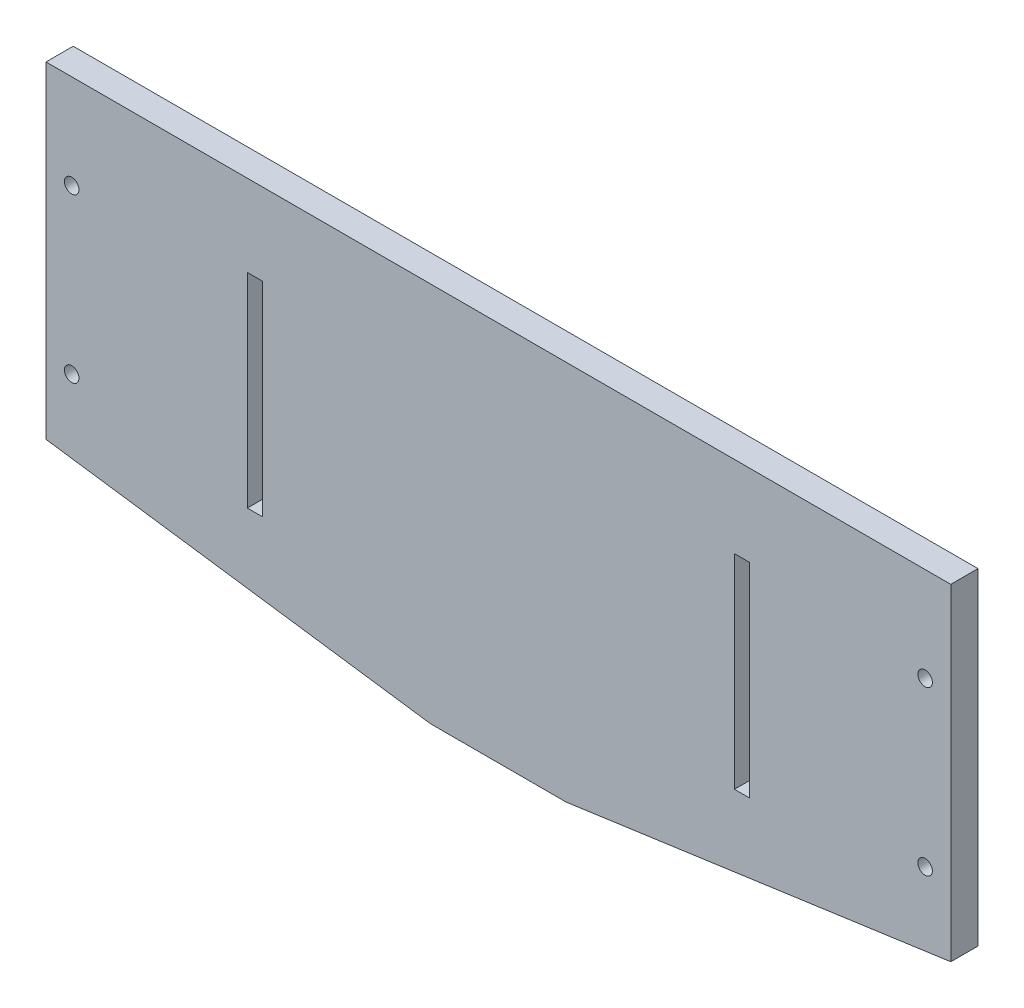
ISO-10303-21;
HEADER;
FILE_DESCRIPTION(('STEP AP214'),'2;1');
FILE_NAME('part.step','',(''),(''),'','','');
FILE_SCHEMA(('AUTOMOTIVE_DESIGN { 1 0 10303 214 1 1 1 1 }'));
ENDSEC;
DATA;
#1=APPLICATION_CONTEXT('core data for automotive mechanical design processes');
#2=APPLICATION_PROTOCOL_DEFINITION('international standard','automotive_design',2000,#1);
#3=PRODUCT_CONTEXT('',#1,'mechanical');
#4=PRODUCT('Part','Part','',(#3));
#5=PRODUCT_RELATED_PRODUCT_CATEGORY('part','',(#4));
#6=PRODUCT_DEFINITION_FORMATION('','',#4);
#7=PRODUCT_DEFINITION_CONTEXT('part definition',#1,'design');
#8=PRODUCT_DEFINITION('design','',#6,#7);
#9=PRODUCT_DEFINITION_SHAPE('','',#8);
#10=(LENGTH_UNIT() NAMED_UNIT(*) SI_UNIT(.MILLI.,.METRE.));
#11=(NAMED_UNIT(*) PLANE_ANGLE_UNIT() SI_UNIT($,.RADIAN.));
#12=(NAMED_UNIT(*) SI_UNIT($,.STERADIAN.) SOLID_ANGLE_UNIT());
#13=UNCERTAINTY_MEASURE_WITH_UNIT(LENGTH_MEASURE(1.E-05),#10,'distance_accuracy_value','');
#14=(GEOMETRIC_REPRESENTATION_CONTEXT(3) GLOBAL_UNCERTAINTY_ASSIGNED_CONTEXT((#13)) GLOBAL_UNIT_ASSIGNED_CONTEXT((#10,
#11,#12)) REPRESENTATION_CONTEXT('',''));
#15=CARTESIAN_POINT('',(0.,0.,0.));
#16=DIRECTION('',(0.,0.,1.));
#17=DIRECTION('',(1.,0.,0.));
#18=AXIS2_PLACEMENT_3D('',#15,#16,#17);
#19=CARTESIAN_POINT('',(0.,0.,0.));
#20=DIRECTION('',(0.,0.,-1.));
#21=DIRECTION('',(-1.,0.,0.));
#22=AXIS2_PLACEMENT_3D('',#19,#20,#21);
#23=PLANE('',#22);
#24=DIRECTION('',(-0.99026806874157,0.139173100960066,0.));
#25=VECTOR('',#24,1.);
#26=CARTESIAN_POINT('',(0.,50.7083117954887,0.));
#27=LINE('',#26,#25);
#28=CARTESIAN_POINT('',(89.7128,38.1,0.));
#29=VERTEX_POINT('',#28);
#30=CARTESIAN_POINT('',(0.,50.7083117954887,0.));
#31=VERTEX_POINT('',#30);
#32=EDGE_CURVE('E152',#29,#31,#27,.T.);
#33=ORIENTED_EDGE('',*,*,#32,.T.);
#34=DIRECTION('',(0.,-1.,0.));
#35=VECTOR('',#34,1.);
#36=CARTESIAN_POINT('',(0.,127.,0.));
#37=LINE('',#36,#35);
#38=CARTESIAN_POINT('',(0.,127.,0.));
#39=VERTEX_POINT('',#38);
#40=EDGE_CURVE('E159',#39,#31,#37,.T.);
#41=ORIENTED_EDGE('',*,*,#40,.F.);
#42=DIRECTION('',(-1.,0.,0.));
#43=VECTOR('',#42,1.);
#44=CARTESIAN_POINT('',(211.1756,127.,0.));
#45=LINE('',#44,#43);
#46=CARTESIAN_POINT('',(211.1756,127.,0.));
#47=VERTEX_POINT('',#46);
#48=EDGE_CURVE('E158',#47,#39,#45,.T.);
#49=ORIENTED_EDGE('',*,*,#48,.F.);
#50=DIRECTION('',(0.,1.,0.));
#51=VECTOR('',#50,1.);
#52=CARTESIAN_POINT('',(211.1756,127.,0.));
#53=LINE('',#52,#51);
#54=CARTESIAN_POINT('',(211.1756,50.7083117954887,0.));
#55=VERTEX_POINT('',#54);
#56=EDGE_CURVE('E150',#55,#47,#53,.T.);
#57=ORIENTED_EDGE('',*,*,#56,.F.);
#58=DIRECTION('',(-0.99026806874157,-0.139173100960066,0.));
#59=VECTOR('',#58,1.);
#60=CARTESIAN_POINT('',(121.4628,38.1,0.));
#61=LINE('',#60,#59);
#62=CARTESIAN_POINT('',(121.4628,38.1,0.));
#63=VERTEX_POINT('',#62);
#64=EDGE_CURVE('E136',#55,#63,#61,.T.);
#65=ORIENTED_EDGE('',*,*,#64,.T.);
#66=DIRECTION('',(-1.,0.,0.));
#67=VECTOR('',#66,1.);
#68=CARTESIAN_POINT('',(89.7128,38.1,0.));
#69=LINE('',#68,#67);
#70=EDGE_CURVE('E143',#63,#29,#69,.T.);
#71=ORIENTED_EDGE('',*,*,#70,.T.);
#72=EDGE_LOOP('',(#33,#41,#49,#57,#65,#71));
#73=FACE_BOUND('',#72,.T.);
#74=DIRECTION('',(0.,-1.,0.));
#75=VECTOR('',#74,1.);
#76=CARTESIAN_POINT('',(46.99,107.95,0.));
#77=LINE('',#76,#75);
#78=CARTESIAN_POINT('',(46.99,107.95,0.));
#79=VERTEX_POINT('',#78);
#80=CARTESIAN_POINT('',(46.99,60.325,0.));
#81=VERTEX_POINT('',#80);
#82=EDGE_CURVE('E248',#79,#81,#77,.T.);
#83=ORIENTED_EDGE('',*,*,#82,.T.);
#84=DIRECTION('',(1.,0.,0.));
#85=VECTOR('',#84,1.);
#86=CARTESIAN_POINT('',(46.99,60.325,0.));
#87=LINE('',#86,#85);
#88=CARTESIAN_POINT('',(50.4952,60.325,0.));
#89=VERTEX_POINT('',#88);
#90=EDGE_CURVE('E259',#81,#89,#87,.T.);
#91=ORIENTED_EDGE('',*,*,#90,.T.);
#92=DIRECTION('',(0.,1.,0.));
#93=VECTOR('',#92,1.);
#94=CARTESIAN_POINT('',(50.4952,107.95,0.));
#95=LINE('',#94,#93);
#96=CARTESIAN_POINT('',(50.4952,107.95,0.));
#97=VERTEX_POINT('',#96);
#98=EDGE_CURVE('E59',#89,#97,#95,.T.);
#99=ORIENTED_EDGE('',*,*,#98,.T.);
#100=DIRECTION('',(-1.,0.,0.));
#101=VECTOR('',#100,1.);
#102=CARTESIAN_POINT('',(46.99,107.95,0.));
#103=LINE('',#102,#101);
#104=EDGE_CURVE('E240',#97,#79,#103,.T.);
#105=ORIENTED_EDGE('',*,*,#104,.T.);
#106=EDGE_LOOP('',(#83,#91,#99,#105));
#107=FACE_BOUND('',#106,.T.);
#108=DIRECTION('',(0.,-1.,0.));
#109=VECTOR('',#108,1.);
#110=CARTESIAN_POINT('',(160.6804,107.95,0.));
#111=LINE('',#110,#109);
#112=CARTESIAN_POINT('',(160.6804,107.95,0.));
#113=VERTEX_POINT('',#112);
#114=CARTESIAN_POINT('',(160.6804,60.325,0.));
#115=VERTEX_POINT('',#114);
#116=EDGE_CURVE('E216',#113,#115,#111,.T.);
#117=ORIENTED_EDGE('',*,*,#116,.T.);
#118=DIRECTION('',(1.,0.,0.));
#119=VECTOR('',#118,1.);
#120=CARTESIAN_POINT('',(160.6804,60.325,0.));
#121=LINE('',#120,#119);
#122=CARTESIAN_POINT('',(164.1856,60.325,0.));
#123=VERTEX_POINT('',#122);
#124=EDGE_CURVE('E231',#115,#123,#121,.T.);
#125=ORIENTED_EDGE('',*,*,#124,.T.);
#126=DIRECTION('',(0.,1.,0.));
#127=VECTOR('',#126,1.);
#128=CARTESIAN_POINT('',(164.1856,107.95,0.));
#129=LINE('',#128,#127);
#130=CARTESIAN_POINT('',(164.1856,107.95,0.));
#131=VERTEX_POINT('',#130);
#132=EDGE_CURVE('E228',#123,#131,#129,.T.);
#133=ORIENTED_EDGE('',*,*,#132,.T.);
#134=DIRECTION('',(-1.,0.,0.));
#135=VECTOR('',#134,1.);
#136=CARTESIAN_POINT('',(160.6804,107.95,0.));
#137=LINE('',#136,#135);
#138=EDGE_CURVE('E206',#131,#113,#137,.T.);
#139=ORIENTED_EDGE('',*,*,#138,.T.);
#140=EDGE_LOOP('',(#117,#125,#133,#139));
#141=FACE_BOUND('',#140,.T.);
#142=CARTESIAN_POINT('',(5.99440000000001,105.0036,0.));
#143=DIRECTION('',(0.,0.,1.));
#144=DIRECTION('',(1.,0.,0.));
#145=AXIS2_PLACEMENT_3D('',#142,#143,#144);
#146=CIRCLE('',#145,1.7);
#147=CARTESIAN_POINT('',(7.69440000000001,105.0036,0.));
#148=VERTEX_POINT('',#147);
#149=EDGE_CURVE('E195',#148,#148,#146,.T.);
#150=ORIENTED_EDGE('',*,*,#149,.T.);
#151=EDGE_LOOP('',(#150));
#152=FACE_BOUND('',#151,.T.);
#153=CARTESIAN_POINT('',(5.99440000000001,66.9036,0.));
#154=DIRECTION('',(0.,0.,1.));
#155=DIRECTION('',(1.,0.,0.));
#156=AXIS2_PLACEMENT_3D('',#153,#154,#155);
#157=CIRCLE('',#156,1.7);
#158=CARTESIAN_POINT('',(7.69440000000001,66.9036,0.));
#159=VERTEX_POINT('',#158);
#160=EDGE_CURVE('E189',#159,#159,#157,.T.);
#161=ORIENTED_EDGE('',*,*,#160,.T.);
#162=EDGE_LOOP('',(#161));
#163=FACE_BOUND('',#162,.T.);
#164=CARTESIAN_POINT('',(205.1812,66.9036,0.));
#165=DIRECTION('',(0.,0.,1.));
#166=DIRECTION('',(1.,0.,0.));
#167=AXIS2_PLACEMENT_3D('',#164,#165,#166);
#168=CIRCLE('',#167,1.70000000000001);
#169=CARTESIAN_POINT('',(206.8812,66.9036,0.));
#170=VERTEX_POINT('',#169);
#171=EDGE_CURVE('E183',#170,#170,#168,.T.);
#172=ORIENTED_EDGE('',*,*,#171,.T.);
#173=EDGE_LOOP('',(#172));
#174=FACE_BOUND('',#173,.T.);
#175=CARTESIAN_POINT('',(205.1812,105.0036,0.));
#176=DIRECTION('',(0.,0.,1.));
#177=DIRECTION('',(1.,0.,0.));
#178=AXIS2_PLACEMENT_3D('',#175,#176,#177);
#179=CIRCLE('',#178,1.70000000000001);
#180=CARTESIAN_POINT('',(206.8812,105.0036,0.));
#181=VERTEX_POINT('',#180);
#182=EDGE_CURVE('E164',#181,#181,#179,.T.);
#183=ORIENTED_EDGE('',*,*,#182,.T.);
#184=EDGE_LOOP('',(#183));
#185=FACE_BOUND('',#184,.T.);
#186=ADVANCED_FACE('F36',(#73,#107,#141,#152,#163,#174,#185),#23,.T.);
#187=CARTESIAN_POINT('',(0.,127.,6.35));
#188=DIRECTION('',(1.,0.,0.));
#189=DIRECTION('',(0.,1.,0.));
#190=AXIS2_PLACEMENT_3D('',#187,#188,#189);
#191=PLANE('',#190);
#192=ORIENTED_EDGE('',*,*,#40,.T.);
#193=DIRECTION('',(0.,0.,1.));
#194=VECTOR('',#193,1.);
#195=CARTESIAN_POINT('',(0.,50.7083117954887,0.));
#196=LINE('',#195,#194);
#197=CARTESIAN_POINT('',(0.,50.7083117954887,6.35));
#198=VERTEX_POINT('',#197);
#199=EDGE_CURVE('E225',#31,#198,#196,.T.);
#200=ORIENTED_EDGE('',*,*,#199,.T.);
#201=DIRECTION('',(0.,-1.,0.));
#202=VECTOR('',#201,1.);
#203=CARTESIAN_POINT('',(0.,127.,6.35));
#204=LINE('',#203,#202);
#205=CARTESIAN_POINT('',(0.,127.,6.35));
#206=VERTEX_POINT('',#205);
#207=EDGE_CURVE('E161',#206,#198,#204,.T.);
#208=ORIENTED_EDGE('',*,*,#207,.F.);
#209=DIRECTION('',(0.,0.,-1.));
#210=VECTOR('',#209,1.);
#211=CARTESIAN_POINT('',(0.,127.,6.35));
#212=LINE('',#211,#210);
#213=EDGE_CURVE('E44',#206,#39,#212,.T.);
#214=ORIENTED_EDGE('',*,*,#213,.T.);
#215=EDGE_LOOP('',(#192,#200,#208,#214));
#216=FACE_BOUND('',#215,.T.);
#217=ADVANCED_FACE('F38',(#216),#191,.F.);
#218=CARTESIAN_POINT('',(211.1756,127.,6.35));
#219=DIRECTION('',(-1.,0.,0.));
#220=DIRECTION('',(0.,-1.,0.));
#221=AXIS2_PLACEMENT_3D('',#218,#219,#220);
#222=PLANE('',#221);
#223=DIRECTION('',(0.,1.,0.));
#224=VECTOR('',#223,1.);
#225=CARTESIAN_POINT('',(211.1756,127.,6.35));
#226=LINE('',#225,#224);
#227=CARTESIAN_POINT('',(211.1756,50.7083117954887,6.35));
#228=VERTEX_POINT('',#227);
#229=CARTESIAN_POINT('',(211.1756,127.,6.35));
#230=VERTEX_POINT('',#229);
#231=EDGE_CURVE('E151',#228,#230,#226,.T.);
#232=ORIENTED_EDGE('',*,*,#231,.F.);
#233=DIRECTION('',(0.,0.,1.));
#234=VECTOR('',#233,1.);
#235=CARTESIAN_POINT('',(211.1756,50.7083117954887,0.));
#236=LINE('',#235,#234);
#237=EDGE_CURVE('E51',#55,#228,#236,.T.);
#238=ORIENTED_EDGE('',*,*,#237,.F.);
#239=ORIENTED_EDGE('',*,*,#56,.T.);
#240=DIRECTION('',(0.,0.,-1.));
#241=VECTOR('',#240,1.);
#242=CARTESIAN_POINT('',(211.1756,127.,6.35));
#243=LINE('',#242,#241);
#244=EDGE_CURVE('E11',#230,#47,#243,.T.);
#245=ORIENTED_EDGE('',*,*,#244,.F.);
#246=EDGE_LOOP('',(#232,#238,#239,#245));
#247=FACE_BOUND('',#246,.T.);
#248=ADVANCED_FACE('F148',(#247),#222,.F.);
#249=CARTESIAN_POINT('',(211.1756,127.,6.35));
#250=DIRECTION('',(0.,-1.,0.));
#251=DIRECTION('',(1.,0.,0.));
#252=AXIS2_PLACEMENT_3D('',#249,#250,#251);
#253=PLANE('',#252);
#254=ORIENTED_EDGE('',*,*,#48,.T.);
#255=ORIENTED_EDGE('',*,*,#213,.F.);
#256=DIRECTION('',(-1.,0.,0.));
#257=VECTOR('',#256,1.);
#258=CARTESIAN_POINT('',(211.1756,127.,6.35));
#259=LINE('',#258,#257);
#260=EDGE_CURVE('E168',#230,#206,#259,.T.);
#261=ORIENTED_EDGE('',*,*,#260,.F.);
#262=ORIENTED_EDGE('',*,*,#244,.T.);
#263=EDGE_LOOP('',(#254,#255,#261,#262));
#264=FACE_BOUND('',#263,.T.);
#265=ADVANCED_FACE('F285',(#264),#253,.F.);
#266=CARTESIAN_POINT('',(0.,0.,6.35));
#267=DIRECTION('',(0.,0.,-1.));
#268=DIRECTION('',(-1.,0.,0.));
#269=AXIS2_PLACEMENT_3D('',#266,#267,#268);
#270=PLANE('',#269);
#271=DIRECTION('',(1.,0.,0.));
#272=VECTOR('',#271,1.);
#273=CARTESIAN_POINT('',(46.99,60.325,6.35));
#274=LINE('',#273,#272);
#275=CARTESIAN_POINT('',(46.99,60.325,6.35));
#276=VERTEX_POINT('',#275);
#277=CARTESIAN_POINT('',(50.4952,60.325,6.35));
#278=VERTEX_POINT('',#277);
#279=EDGE_CURVE('E252',#276,#278,#274,.T.);
#280=ORIENTED_EDGE('',*,*,#279,.F.);
#281=DIRECTION('',(0.,-1.,0.));
#282=VECTOR('',#281,1.);
#283=CARTESIAN_POINT('',(46.99,107.95,6.35));
#284=LINE('',#283,#282);
#285=CARTESIAN_POINT('',(46.99,107.95,6.35));
#286=VERTEX_POINT('',#285);
#287=EDGE_CURVE('E212',#286,#276,#284,.T.);
#288=ORIENTED_EDGE('',*,*,#287,.F.);
#289=DIRECTION('',(-1.,0.,0.));
#290=VECTOR('',#289,1.);
#291=CARTESIAN_POINT('',(46.99,107.95,6.35));
#292=LINE('',#291,#290);
#293=CARTESIAN_POINT('',(50.4952,107.95,6.35));
#294=VERTEX_POINT('',#293);
#295=EDGE_CURVE('E245',#294,#286,#292,.T.);
#296=ORIENTED_EDGE('',*,*,#295,.F.);
#297=DIRECTION('',(0.,1.,0.));
#298=VECTOR('',#297,1.);
#299=CARTESIAN_POINT('',(50.4952,107.95,6.35));
#300=LINE('',#299,#298);
#301=EDGE_CURVE('E249',#278,#294,#300,.T.);
#302=ORIENTED_EDGE('',*,*,#301,.F.);
#303=EDGE_LOOP('',(#280,#288,#296,#302));
#304=FACE_BOUND('',#303,.T.);
#305=DIRECTION('',(1.,0.,0.));
#306=VECTOR('',#305,1.);
#307=CARTESIAN_POINT('',(160.6804,60.325,6.35));
#308=LINE('',#307,#306);
#309=CARTESIAN_POINT('',(160.6804,60.325,6.35));
#310=VERTEX_POINT('',#309);
#311=CARTESIAN_POINT('',(164.1856,60.325,6.35));
#312=VERTEX_POINT('',#311);
#313=EDGE_CURVE('E220',#310,#312,#308,.T.);
#314=ORIENTED_EDGE('',*,*,#313,.F.);
#315=DIRECTION('',(0.,-1.,0.));
#316=VECTOR('',#315,1.);
#317=CARTESIAN_POINT('',(160.6804,107.95,6.35));
#318=LINE('',#317,#316);
#319=CARTESIAN_POINT('',(160.6804,107.95,6.35));
#320=VERTEX_POINT('',#319);
#321=EDGE_CURVE('E223',#320,#310,#318,.T.);
#322=ORIENTED_EDGE('',*,*,#321,.F.);
#323=DIRECTION('',(-1.,0.,0.));
#324=VECTOR('',#323,1.);
#325=CARTESIAN_POINT('',(160.6804,107.95,6.35));
#326=LINE('',#325,#324);
#327=CARTESIAN_POINT('',(164.1856,107.95,6.35));
#328=VERTEX_POINT('',#327);
#329=EDGE_CURVE('E213',#328,#320,#326,.T.);
#330=ORIENTED_EDGE('',*,*,#329,.F.);
#331=DIRECTION('',(0.,1.,0.));
#332=VECTOR('',#331,1.);
#333=CARTESIAN_POINT('',(164.1856,107.95,6.35));
#334=LINE('',#333,#332);
#335=EDGE_CURVE('E217',#312,#328,#334,.T.);
#336=ORIENTED_EDGE('',*,*,#335,.F.);
#337=EDGE_LOOP('',(#314,#322,#330,#336));
#338=FACE_BOUND('',#337,.T.);
#339=CARTESIAN_POINT('',(5.99440000000001,105.0036,6.35));
#340=DIRECTION('',(0.,0.,1.));
#341=DIRECTION('',(1.,0.,0.));
#342=AXIS2_PLACEMENT_3D('',#339,#340,#341);
#343=CIRCLE('',#342,1.7);
#344=CARTESIAN_POINT('',(7.69440000000001,105.0036,6.35));
#345=VERTEX_POINT('',#344);
#346=EDGE_CURVE('E198',#345,#345,#343,.T.);
#347=ORIENTED_EDGE('',*,*,#346,.F.);
#348=EDGE_LOOP('',(#347));
#349=FACE_BOUND('',#348,.T.);
#350=CARTESIAN_POINT('',(5.99440000000001,66.9036,6.35));
#351=DIRECTION('',(0.,0.,1.));
#352=DIRECTION('',(1.,0.,0.));
#353=AXIS2_PLACEMENT_3D('',#350,#351,#352);
#354=CIRCLE('',#353,1.7);
#355=CARTESIAN_POINT('',(7.69440000000001,66.9036,6.35));
#356=VERTEX_POINT('',#355);
#357=EDGE_CURVE('E192',#356,#356,#354,.T.);
#358=ORIENTED_EDGE('',*,*,#357,.F.);
#359=EDGE_LOOP('',(#358));
#360=FACE_BOUND('',#359,.T.);
#361=CARTESIAN_POINT('',(205.1812,66.9036,6.35));
#362=DIRECTION('',(0.,0.,1.));
#363=DIRECTION('',(1.,0.,0.));
#364=AXIS2_PLACEMENT_3D('',#361,#362,#363);
#365=CIRCLE('',#364,1.70000000000001);
#366=CARTESIAN_POINT('',(206.8812,66.9036,6.35));
#367=VERTEX_POINT('',#366);
#368=EDGE_CURVE('E186',#367,#367,#365,.T.);
#369=ORIENTED_EDGE('',*,*,#368,.F.);
#370=EDGE_LOOP('',(#369));
#371=FACE_BOUND('',#370,.T.);
#372=CARTESIAN_POINT('',(205.1812,105.0036,6.35));
#373=DIRECTION('',(0.,0.,1.));
#374=DIRECTION('',(1.,0.,0.));
#375=AXIS2_PLACEMENT_3D('',#372,#373,#374);
#376=CIRCLE('',#375,1.70000000000001);
#377=CARTESIAN_POINT('',(206.8812,105.0036,6.35));
#378=VERTEX_POINT('',#377);
#379=EDGE_CURVE('E180',#378,#378,#376,.T.);
#380=ORIENTED_EDGE('',*,*,#379,.F.);
#381=EDGE_LOOP('',(#380));
#382=FACE_BOUND('',#381,.T.);
#383=ORIENTED_EDGE('',*,*,#207,.T.);
#384=DIRECTION('',(-0.99026806874157,0.139173100960066,0.));
#385=VECTOR('',#384,1.);
#386=CARTESIAN_POINT('',(0.,50.7083117954887,6.35));
#387=LINE('',#386,#385);
#388=CARTESIAN_POINT('',(89.7128,38.1,6.35));
#389=VERTEX_POINT('',#388);
#390=EDGE_CURVE('E144',#389,#198,#387,.T.);
#391=ORIENTED_EDGE('',*,*,#390,.F.);
#392=DIRECTION('',(-1.,0.,0.));
#393=VECTOR('',#392,1.);
#394=CARTESIAN_POINT('',(89.7128,38.1,6.35));
#395=LINE('',#394,#393);
#396=CARTESIAN_POINT('',(121.4628,38.1,6.35));
#397=VERTEX_POINT('',#396);
#398=EDGE_CURVE('E270',#397,#389,#395,.T.);
#399=ORIENTED_EDGE('',*,*,#398,.F.);
#400=DIRECTION('',(-0.99026806874157,-0.139173100960066,0.));
#401=VECTOR('',#400,1.);
#402=CARTESIAN_POINT('',(121.4628,38.1,6.35));
#403=LINE('',#402,#401);
#404=EDGE_CURVE('E273',#228,#397,#403,.T.);
#405=ORIENTED_EDGE('',*,*,#404,.F.);
#406=ORIENTED_EDGE('',*,*,#231,.T.);
#407=ORIENTED_EDGE('',*,*,#260,.T.);
#408=EDGE_LOOP('',(#383,#391,#399,#405,#406,#407));
#409=FACE_BOUND('',#408,.T.);
#410=ADVANCED_FACE('F283',(#304,#338,#349,#360,#371,#382,#409),#270,.F.);
#411=CARTESIAN_POINT('',(205.1812,105.0036,6.35));
#412=DIRECTION('',(0.,0.,1.));
#413=DIRECTION('',(1.,0.,0.));
#414=AXIS2_PLACEMENT_3D('',#411,#412,#413);
#415=CYLINDRICAL_SURFACE('',#414,1.70000000000001);
#416=ORIENTED_EDGE('',*,*,#182,.F.);
#417=EDGE_LOOP('',(#416));
#418=FACE_BOUND('',#417,.T.);
#419=ORIENTED_EDGE('',*,*,#379,.T.);
#420=EDGE_LOOP('',(#419));
#421=FACE_BOUND('',#420,.T.);
#422=ADVANCED_FACE('F292',(#418,#421),#415,.F.);
#423=CARTESIAN_POINT('',(205.1812,66.9036,6.35));
#424=DIRECTION('',(0.,0.,1.));
#425=DIRECTION('',(1.,0.,0.));
#426=AXIS2_PLACEMENT_3D('',#423,#424,#425);
#427=CYLINDRICAL_SURFACE('',#426,1.70000000000001);
#428=ORIENTED_EDGE('',*,*,#171,.F.);
#429=EDGE_LOOP('',(#428));
#430=FACE_BOUND('',#429,.T.);
#431=ORIENTED_EDGE('',*,*,#368,.T.);
#432=EDGE_LOOP('',(#431));
#433=FACE_BOUND('',#432,.T.);
#434=ADVANCED_FACE('F303',(#430,#433),#427,.F.);
#435=CARTESIAN_POINT('',(5.99440000000001,66.9036,6.35));
#436=DIRECTION('',(0.,0.,1.));
#437=DIRECTION('',(1.,0.,0.));
#438=AXIS2_PLACEMENT_3D('',#435,#436,#437);
#439=CYLINDRICAL_SURFACE('',#438,1.7);
#440=ORIENTED_EDGE('',*,*,#160,.F.);
#441=EDGE_LOOP('',(#440));
#442=FACE_BOUND('',#441,.T.);
#443=ORIENTED_EDGE('',*,*,#357,.T.);
#444=EDGE_LOOP('',(#443));
#445=FACE_BOUND('',#444,.T.);
#446=ADVANCED_FACE('F307',(#442,#445),#439,.F.);
#447=CARTESIAN_POINT('',(5.99440000000001,105.0036,6.35));
#448=DIRECTION('',(0.,0.,1.));
#449=DIRECTION('',(1.,0.,0.));
#450=AXIS2_PLACEMENT_3D('',#447,#448,#449);
#451=CYLINDRICAL_SURFACE('',#450,1.7);
#452=ORIENTED_EDGE('',*,*,#149,.F.);
#453=EDGE_LOOP('',(#452));
#454=FACE_BOUND('',#453,.T.);
#455=ORIENTED_EDGE('',*,*,#346,.T.);
#456=EDGE_LOOP('',(#455));
#457=FACE_BOUND('',#456,.T.);
#458=ADVANCED_FACE('F311',(#454,#457),#451,.F.);
#459=CARTESIAN_POINT('',(160.6804,107.95,0.));
#460=DIRECTION('',(-1.,0.,0.));
#461=DIRECTION('',(0.,0.,1.));
#462=AXIS2_PLACEMENT_3D('',#459,#460,#461);
#463=PLANE('',#462);
#464=ORIENTED_EDGE('',*,*,#321,.T.);
#465=DIRECTION('',(0.,0.,1.));
#466=VECTOR('',#465,1.);
#467=CARTESIAN_POINT('',(160.6804,60.325,0.));
#468=LINE('',#467,#466);
#469=EDGE_CURVE('E202',#115,#310,#468,.T.);
#470=ORIENTED_EDGE('',*,*,#469,.F.);
#471=ORIENTED_EDGE('',*,*,#116,.F.);
#472=DIRECTION('',(0.,0.,1.));
#473=VECTOR('',#472,1.);
#474=CARTESIAN_POINT('',(160.6804,107.95,0.));
#475=LINE('',#474,#473);
#476=EDGE_CURVE('E210',#113,#320,#475,.T.);
#477=ORIENTED_EDGE('',*,*,#476,.T.);
#478=EDGE_LOOP('',(#464,#470,#471,#477));
#479=FACE_BOUND('',#478,.T.);
#480=ADVANCED_FACE('F315',(#479),#463,.F.);
#481=CARTESIAN_POINT('',(160.6804,107.95,0.));
#482=DIRECTION('',(0.,1.,0.));
#483=DIRECTION('',(-1.,0.,0.));
#484=AXIS2_PLACEMENT_3D('',#481,#482,#483);
#485=PLANE('',#484);
#486=ORIENTED_EDGE('',*,*,#329,.T.);
#487=ORIENTED_EDGE('',*,*,#476,.F.);
#488=ORIENTED_EDGE('',*,*,#138,.F.);
#489=DIRECTION('',(0.,0.,1.));
#490=VECTOR('',#489,1.);
#491=CARTESIAN_POINT('',(164.1856,107.95,0.));
#492=LINE('',#491,#490);
#493=EDGE_CURVE('E208',#131,#328,#492,.T.);
#494=ORIENTED_EDGE('',*,*,#493,.T.);
#495=EDGE_LOOP('',(#486,#487,#488,#494));
#496=FACE_BOUND('',#495,.T.);
#497=ADVANCED_FACE('F319',(#496),#485,.F.);
#498=CARTESIAN_POINT('',(164.1856,107.95,0.));
#499=DIRECTION('',(1.,0.,0.));
#500=DIRECTION('',(0.,1.,0.));
#501=AXIS2_PLACEMENT_3D('',#498,#499,#500);
#502=PLANE('',#501);
#503=ORIENTED_EDGE('',*,*,#335,.T.);
#504=ORIENTED_EDGE('',*,*,#493,.F.);
#505=ORIENTED_EDGE('',*,*,#132,.F.);
#506=DIRECTION('',(0.,0.,1.));
#507=VECTOR('',#506,1.);
#508=CARTESIAN_POINT('',(164.1856,60.325,0.));
#509=LINE('',#508,#507);
#510=EDGE_CURVE('E205',#123,#312,#509,.T.);
#511=ORIENTED_EDGE('',*,*,#510,.T.);
#512=EDGE_LOOP('',(#503,#504,#505,#511));
#513=FACE_BOUND('',#512,.T.);
#514=ADVANCED_FACE('F325',(#513),#502,.F.);
#515=CARTESIAN_POINT('',(160.6804,60.325,0.));
#516=DIRECTION('',(0.,-1.,0.));
#517=DIRECTION('',(0.,0.,-1.));
#518=AXIS2_PLACEMENT_3D('',#515,#516,#517);
#519=PLANE('',#518);
#520=ORIENTED_EDGE('',*,*,#313,.T.);
#521=ORIENTED_EDGE('',*,*,#510,.F.);
#522=ORIENTED_EDGE('',*,*,#124,.F.);
#523=ORIENTED_EDGE('',*,*,#469,.T.);
#524=EDGE_LOOP('',(#520,#521,#522,#523));
#525=FACE_BOUND('',#524,.T.);
#526=ADVANCED_FACE('F321',(#525),#519,.F.);
#527=CARTESIAN_POINT('',(46.99,107.95,0.));
#528=DIRECTION('',(-1.,0.,0.));
#529=DIRECTION('',(0.,-1.,0.));
#530=AXIS2_PLACEMENT_3D('',#527,#528,#529);
#531=PLANE('',#530);
#532=ORIENTED_EDGE('',*,*,#287,.T.);
#533=DIRECTION('',(0.,0.,1.));
#534=VECTOR('',#533,1.);
#535=CARTESIAN_POINT('',(46.99,60.325,0.));
#536=LINE('',#535,#534);
#537=EDGE_CURVE('E236',#81,#276,#536,.T.);
#538=ORIENTED_EDGE('',*,*,#537,.F.);
#539=ORIENTED_EDGE('',*,*,#82,.F.);
#540=DIRECTION('',(0.,0.,1.));
#541=VECTOR('',#540,1.);
#542=CARTESIAN_POINT('',(46.99,107.95,0.));
#543=LINE('',#542,#541);
#544=EDGE_CURVE('E201',#79,#286,#543,.T.);
#545=ORIENTED_EDGE('',*,*,#544,.T.);
#546=EDGE_LOOP('',(#532,#538,#539,#545));
#547=FACE_BOUND('',#546,.T.);
#548=ADVANCED_FACE('F324',(#547),#531,.F.);
#549=CARTESIAN_POINT('',(46.99,107.95,0.));
#550=DIRECTION('',(0.,1.,0.));
#551=DIRECTION('',(-1.,0.,0.));
#552=AXIS2_PLACEMENT_3D('',#549,#550,#551);
#553=PLANE('',#552);
#554=ORIENTED_EDGE('',*,*,#295,.T.);
#555=ORIENTED_EDGE('',*,*,#544,.F.);
#556=ORIENTED_EDGE('',*,*,#104,.F.);
#557=DIRECTION('',(0.,0.,1.));
#558=VECTOR('',#557,1.);
#559=CARTESIAN_POINT('',(50.4952,107.95,0.));
#560=LINE('',#559,#558);
#561=EDGE_CURVE('E242',#97,#294,#560,.T.);
#562=ORIENTED_EDGE('',*,*,#561,.T.);
#563=EDGE_LOOP('',(#554,#555,#556,#562));
#564=FACE_BOUND('',#563,.T.);
#565=ADVANCED_FACE('F335',(#564),#553,.F.);
#566=CARTESIAN_POINT('',(50.4952,107.95,0.));
#567=DIRECTION('',(1.,0.,0.));
#568=DIRECTION('',(0.,0.,-1.));
#569=AXIS2_PLACEMENT_3D('',#566,#567,#568);
#570=PLANE('',#569);
#571=ORIENTED_EDGE('',*,*,#301,.T.);
#572=ORIENTED_EDGE('',*,*,#561,.F.);
#573=ORIENTED_EDGE('',*,*,#98,.F.);
#574=DIRECTION('',(0.,0.,1.));
#575=VECTOR('',#574,1.);
#576=CARTESIAN_POINT('',(50.4952,60.325,0.));
#577=LINE('',#576,#575);
#578=EDGE_CURVE('E239',#89,#278,#577,.T.);
#579=ORIENTED_EDGE('',*,*,#578,.T.);
#580=EDGE_LOOP('',(#571,#572,#573,#579));
#581=FACE_BOUND('',#580,.T.);
#582=ADVANCED_FACE('F340',(#581),#570,.F.);
#583=CARTESIAN_POINT('',(46.99,60.325,0.));
#584=DIRECTION('',(0.,-1.,0.));
#585=DIRECTION('',(0.,0.,-1.));
#586=AXIS2_PLACEMENT_3D('',#583,#584,#585);
#587=PLANE('',#586);
#588=ORIENTED_EDGE('',*,*,#279,.T.);
#589=ORIENTED_EDGE('',*,*,#578,.F.);
#590=ORIENTED_EDGE('',*,*,#90,.F.);
#591=ORIENTED_EDGE('',*,*,#537,.T.);
#592=EDGE_LOOP('',(#588,#589,#590,#591));
#593=FACE_BOUND('',#592,.T.);
#594=ADVANCED_FACE('F337',(#593),#587,.F.);
#595=CARTESIAN_POINT('',(0.,50.7083117954887,0.));
#596=DIRECTION('',(0.139173100960066,0.99026806874157,0.));
#597=DIRECTION('',(-0.99026806874157,0.139173100960066,0.));
#598=AXIS2_PLACEMENT_3D('',#595,#596,#597);
#599=PLANE('',#598);
#600=ORIENTED_EDGE('',*,*,#390,.T.);
#601=ORIENTED_EDGE('',*,*,#199,.F.);
#602=ORIENTED_EDGE('',*,*,#32,.F.);
#603=DIRECTION('',(0.,0.,1.));
#604=VECTOR('',#603,1.);
#605=CARTESIAN_POINT('',(89.7128,38.1,0.));
#606=LINE('',#605,#604);
#607=EDGE_CURVE('E265',#29,#389,#606,.T.);
#608=ORIENTED_EDGE('',*,*,#607,.T.);
#609=EDGE_LOOP('',(#600,#601,#602,#608));
#610=FACE_BOUND('',#609,.T.);
#611=ADVANCED_FACE('F282',(#610),#599,.F.);
#612=CARTESIAN_POINT('',(89.7128,38.1,0.));
#613=DIRECTION('',(0.,1.,0.));
#614=DIRECTION('',(0.,0.,1.));
#615=AXIS2_PLACEMENT_3D('',#612,#613,#614);
#616=PLANE('',#615);
#617=ORIENTED_EDGE('',*,*,#398,.T.);
#618=ORIENTED_EDGE('',*,*,#607,.F.);
#619=ORIENTED_EDGE('',*,*,#70,.F.);
#620=DIRECTION('',(0.,0.,1.));
#621=VECTOR('',#620,1.);
#622=CARTESIAN_POINT('',(121.4628,38.1,0.));
#623=LINE('',#622,#621);
#624=EDGE_CURVE('E138',#63,#397,#623,.T.);
#625=ORIENTED_EDGE('',*,*,#624,.T.);
#626=EDGE_LOOP('',(#617,#618,#619,#625));
#627=FACE_BOUND('',#626,.T.);
#628=ADVANCED_FACE('F278',(#627),#616,.F.);
#629=CARTESIAN_POINT('',(121.4628,38.1,0.));
#630=DIRECTION('',(-0.139173100960066,0.99026806874157,0.));
#631=DIRECTION('',(-0.99026806874157,-0.139173100960066,0.));
#632=AXIS2_PLACEMENT_3D('',#629,#630,#631);
#633=PLANE('',#632);
#634=ORIENTED_EDGE('',*,*,#404,.T.);
#635=ORIENTED_EDGE('',*,*,#624,.F.);
#636=ORIENTED_EDGE('',*,*,#64,.F.);
#637=ORIENTED_EDGE('',*,*,#237,.T.);
#638=EDGE_LOOP('',(#634,#635,#636,#637));
#639=FACE_BOUND('',#638,.T.);
#640=ADVANCED_FACE('F137',(#639),#633,.F.);
#641=CLOSED_SHELL('',(#186,#217,#248,#265,#410,#422,#434,#446,#458,#480,#497,#514,#526,#548,
#565,#582,#594,#611,#628,#640));
#642=MANIFOLD_SOLID_BREP('B2',#641);
#643=ADVANCED_BREP_SHAPE_REPRESENTATION('',(#18,#642),#14);
#644=SHAPE_DEFINITION_REPRESENTATION(#9,#643);
ENDSEC;
END-ISO-10303-21;
